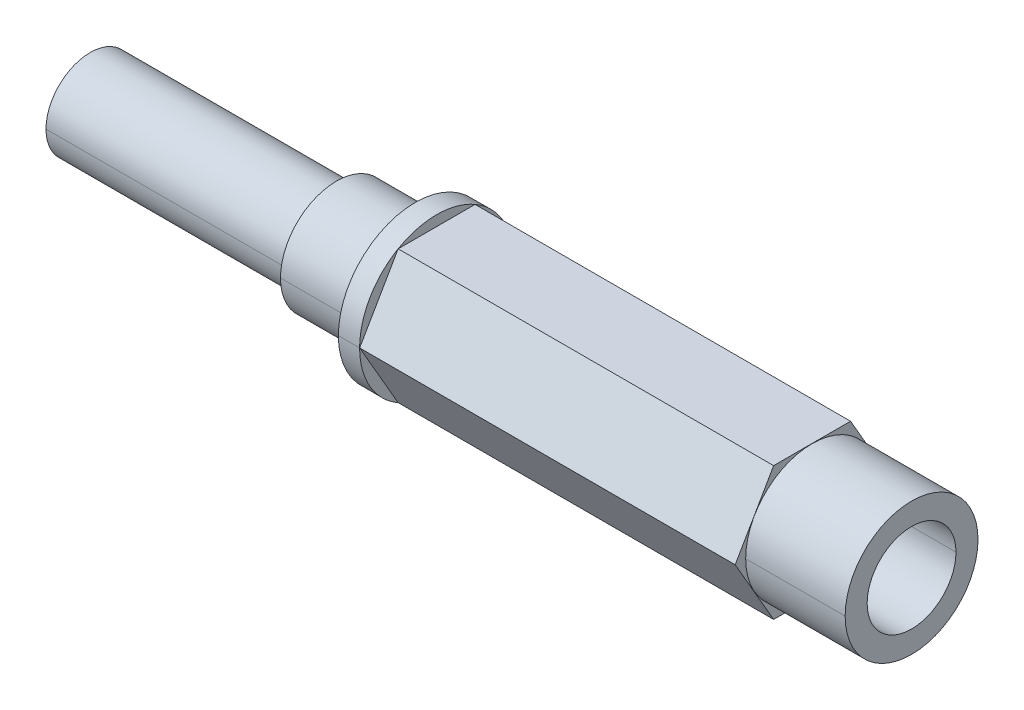
ISO-10303-21;
HEADER;
FILE_DESCRIPTION(('STEP AP214'),'2;1');
FILE_NAME('part.step','',(''),(''),'','','');
FILE_SCHEMA(('AUTOMOTIVE_DESIGN { 1 0 10303 214 1 1 1 1 }'));
ENDSEC;
DATA;
#1=APPLICATION_CONTEXT('core data for automotive mechanical design processes');
#2=APPLICATION_PROTOCOL_DEFINITION('international standard','automotive_design',2000,#1);
#3=PRODUCT_CONTEXT('',#1,'mechanical');
#4=PRODUCT('Part','Part','',(#3));
#5=PRODUCT_RELATED_PRODUCT_CATEGORY('part','',(#4));
#6=PRODUCT_DEFINITION_FORMATION('','',#4);
#7=PRODUCT_DEFINITION_CONTEXT('part definition',#1,'design');
#8=PRODUCT_DEFINITION('design','',#6,#7);
#9=PRODUCT_DEFINITION_SHAPE('','',#8);
#10=(LENGTH_UNIT() NAMED_UNIT(*) SI_UNIT(.MILLI.,.METRE.));
#11=(NAMED_UNIT(*) PLANE_ANGLE_UNIT() SI_UNIT($,.RADIAN.));
#12=(NAMED_UNIT(*) SI_UNIT($,.STERADIAN.) SOLID_ANGLE_UNIT());
#13=UNCERTAINTY_MEASURE_WITH_UNIT(LENGTH_MEASURE(1.E-05),#10,'distance_accuracy_value','');
#14=(GEOMETRIC_REPRESENTATION_CONTEXT(3) GLOBAL_UNCERTAINTY_ASSIGNED_CONTEXT((#13)) GLOBAL_UNIT_ASSIGNED_CONTEXT((#10,
#11,#12)) REPRESENTATION_CONTEXT('',''));
#15=CARTESIAN_POINT('',(0.,0.,0.));
#16=DIRECTION('',(0.,0.,1.));
#17=DIRECTION('',(1.,0.,0.));
#18=AXIS2_PLACEMENT_3D('',#15,#16,#17);
#19=CARTESIAN_POINT('',(18.0848,0.,0.));
#20=DIRECTION('',(1.,0.,0.));
#21=DIRECTION('',(0.,0.,-1.));
#22=AXIS2_PLACEMENT_3D('',#19,#20,#21);
#23=PLANE('',#22);
#24=CARTESIAN_POINT('',(18.0848,0.,0.));
#25=DIRECTION('',(1.,0.,0.));
#26=DIRECTION('',(0.,0.,-1.));
#27=AXIS2_PLACEMENT_3D('',#24,#25,#26);
#28=CIRCLE('',#27,3.17500000000007);
#29=CARTESIAN_POINT('',(18.0848,0.,-3.17500000000007));
#30=VERTEX_POINT('',#29);
#31=CARTESIAN_POINT('',(18.0848,0.,3.175));
#32=VERTEX_POINT('',#31);
#33=EDGE_CURVE('E11',#30,#32,#28,.T.);
#34=ORIENTED_EDGE('',*,*,#33,.T.);
#35=CARTESIAN_POINT('',(18.0848,0.,0.));
#36=DIRECTION('',(1.,0.,0.));
#37=DIRECTION('',(0.,0.,-1.));
#38=AXIS2_PLACEMENT_3D('',#35,#36,#37);
#39=CIRCLE('',#38,3.17500000000007);
#40=EDGE_CURVE('E249',#32,#30,#39,.T.);
#41=ORIENTED_EDGE('',*,*,#40,.T.);
#42=EDGE_LOOP('',(#34,#41));
#43=FACE_BOUND('',#42,.T.);
#44=ADVANCED_FACE('F16',(#43),#23,.T.);
#45=CARTESIAN_POINT('',(18.0848,0.,0.));
#46=DIRECTION('',(1.,0.,0.));
#47=DIRECTION('',(0.,0.,-1.));
#48=AXIS2_PLACEMENT_3D('',#45,#46,#47);
#49=CYLINDRICAL_SURFACE('',#48,3.17500000000007);
#50=DIRECTION('',(1.,0.,0.));
#51=VECTOR('',#50,1.);
#52=CARTESIAN_POINT('',(18.0848,0.,3.17500000000007));
#53=LINE('',#52,#51);
#54=CARTESIAN_POINT('',(33.9598,0.,3.175));
#55=VERTEX_POINT('',#54);
#56=EDGE_CURVE('E253',#32,#55,#53,.T.);
#57=ORIENTED_EDGE('',*,*,#56,.F.);
#58=ORIENTED_EDGE('',*,*,#33,.F.);
#59=DIRECTION('',(1.,0.,0.));
#60=VECTOR('',#59,1.);
#61=CARTESIAN_POINT('',(18.0848,0.,-3.17500000000007));
#62=LINE('',#61,#60);
#63=CARTESIAN_POINT('',(33.9598,0.,-3.17500000000007));
#64=VERTEX_POINT('',#63);
#65=EDGE_CURVE('E293',#30,#64,#62,.T.);
#66=ORIENTED_EDGE('',*,*,#65,.T.);
#67=CARTESIAN_POINT('',(33.9598,0.,0.));
#68=DIRECTION('',(1.,0.,0.));
#69=DIRECTION('',(0.,0.,-1.));
#70=AXIS2_PLACEMENT_3D('',#67,#68,#69);
#71=CIRCLE('',#70,3.17500000000007);
#72=EDGE_CURVE('E27',#64,#55,#71,.T.);
#73=ORIENTED_EDGE('',*,*,#72,.T.);
#74=EDGE_LOOP('',(#57,#58,#66,#73));
#75=FACE_BOUND('',#74,.T.);
#76=ADVANCED_FACE('F495',(#75),#49,.F.);
#77=CARTESIAN_POINT('',(33.9598,0.,0.));
#78=DIRECTION('',(1.,0.,0.));
#79=DIRECTION('',(0.,0.,-1.));
#80=AXIS2_PLACEMENT_3D('',#77,#78,#79);
#81=PLANE('',#80);
#82=ORIENTED_EDGE('',*,*,#72,.F.);
#83=CARTESIAN_POINT('',(33.9598,0.,0.));
#84=DIRECTION('',(1.,0.,0.));
#85=DIRECTION('',(0.,0.,-1.));
#86=AXIS2_PLACEMENT_3D('',#83,#84,#85);
#87=CIRCLE('',#86,3.17500000000007);
#88=EDGE_CURVE('E289',#55,#64,#87,.T.);
#89=ORIENTED_EDGE('',*,*,#88,.F.);
#90=EDGE_LOOP('',(#82,#89));
#91=FACE_BOUND('',#90,.T.);
#92=CARTESIAN_POINT('',(33.9598,0.,0.));
#93=DIRECTION('',(1.,0.,0.));
#94=DIRECTION('',(0.,0.,-1.));
#95=AXIS2_PLACEMENT_3D('',#92,#93,#94);
#96=CIRCLE('',#95,4.7498000000001);
#97=CARTESIAN_POINT('',(33.9598,0.,4.7498));
#98=VERTEX_POINT('',#97);
#99=CARTESIAN_POINT('',(33.9598,0.,-4.7498));
#100=VERTEX_POINT('',#99);
#101=EDGE_CURVE('E206',#98,#100,#96,.T.);
#102=ORIENTED_EDGE('',*,*,#101,.T.);
#103=CARTESIAN_POINT('',(33.9598,0.,0.));
#104=DIRECTION('',(1.,0.,0.));
#105=DIRECTION('',(0.,0.,-1.));
#106=AXIS2_PLACEMENT_3D('',#103,#104,#105);
#107=CIRCLE('',#106,4.7498000000001);
#108=EDGE_CURVE('E298',#100,#98,#107,.T.);
#109=ORIENTED_EDGE('',*,*,#108,.T.);
#110=EDGE_LOOP('',(#102,#109));
#111=FACE_BOUND('',#110,.T.);
#112=ADVANCED_FACE('F491',(#91,#111),#81,.T.);
#113=CARTESIAN_POINT('',(33.9598,0.,0.));
#114=DIRECTION('',(-1.,0.,0.));
#115=DIRECTION('',(0.,0.,1.));
#116=AXIS2_PLACEMENT_3D('',#113,#114,#115);
#117=CYLINDRICAL_SURFACE('',#116,4.7498000000001);
#118=DIRECTION('',(-1.,0.,0.));
#119=VECTOR('',#118,1.);
#120=CARTESIAN_POINT('',(33.9598,0.,-4.7498000000001));
#121=LINE('',#120,#119);
#122=CARTESIAN_POINT('',(26.8478,0.,-4.7498));
#123=VERTEX_POINT('',#122);
#124=EDGE_CURVE('E302',#100,#123,#121,.T.);
#125=ORIENTED_EDGE('',*,*,#124,.F.);
#126=ORIENTED_EDGE('',*,*,#101,.F.);
#127=DIRECTION('',(-1.,0.,0.));
#128=VECTOR('',#127,1.);
#129=CARTESIAN_POINT('',(33.9598,0.,4.7498000000001));
#130=LINE('',#129,#128);
#131=CARTESIAN_POINT('',(26.8478,0.,4.7498));
#132=VERTEX_POINT('',#131);
#133=EDGE_CURVE('E309',#98,#132,#130,.T.);
#134=ORIENTED_EDGE('',*,*,#133,.T.);
#135=CARTESIAN_POINT('',(26.8478,0.,0.));
#136=DIRECTION('',(1.,0.,0.));
#137=DIRECTION('',(0.,0.,-1.));
#138=AXIS2_PLACEMENT_3D('',#135,#136,#137);
#139=CIRCLE('',#138,4.7498000000001);
#140=EDGE_CURVE('E209',#132,#123,#139,.T.);
#141=ORIENTED_EDGE('',*,*,#140,.T.);
#142=EDGE_LOOP('',(#125,#126,#134,#141));
#143=FACE_BOUND('',#142,.T.);
#144=ADVANCED_FACE('F435',(#143),#117,.T.);
#145=CARTESIAN_POINT('',(-24.765,0.,0.));
#146=DIRECTION('',(-1.,0.,0.));
#147=DIRECTION('',(0.,1.,0.));
#148=AXIS2_PLACEMENT_3D('',#145,#146,#147);
#149=PLANE('',#148);
#150=CARTESIAN_POINT('',(-24.765,0.,0.));
#151=DIRECTION('',(-1.,0.,0.));
#152=DIRECTION('',(0.,0.,1.));
#153=AXIS2_PLACEMENT_3D('',#150,#151,#152);
#154=CIRCLE('',#153,3.16230000000006);
#155=CARTESIAN_POINT('',(-24.765,0.,-3.1623));
#156=VERTEX_POINT('',#155);
#157=CARTESIAN_POINT('',(-24.765,0.,3.1623));
#158=VERTEX_POINT('',#157);
#159=EDGE_CURVE('E140',#156,#158,#154,.T.);
#160=ORIENTED_EDGE('',*,*,#159,.T.);
#161=CARTESIAN_POINT('',(-24.765,0.,0.));
#162=DIRECTION('',(-1.,0.,0.));
#163=DIRECTION('',(0.,0.,1.));
#164=AXIS2_PLACEMENT_3D('',#161,#162,#163);
#165=CIRCLE('',#164,3.16230000000006);
#166=EDGE_CURVE('E247',#158,#156,#165,.T.);
#167=ORIENTED_EDGE('',*,*,#166,.T.);
#168=EDGE_LOOP('',(#160,#167));
#169=FACE_BOUND('',#168,.T.);
#170=ADVANCED_FACE('F430',(#169),#149,.T.);
#171=CARTESIAN_POINT('',(-24.765,0.,0.));
#172=DIRECTION('',(1.,0.,0.));
#173=DIRECTION('',(0.,0.,-1.));
#174=AXIS2_PLACEMENT_3D('',#171,#172,#173);
#175=CYLINDRICAL_SURFACE('',#174,3.16230000000006);
#176=DIRECTION('',(1.,0.,0.));
#177=VECTOR('',#176,1.);
#178=CARTESIAN_POINT('',(-24.765,0.,3.16230000000006));
#179=LINE('',#178,#177);
#180=CARTESIAN_POINT('',(-7.1628,0.,3.1623));
#181=VERTEX_POINT('',#180);
#182=EDGE_CURVE('E243',#158,#181,#179,.T.);
#183=ORIENTED_EDGE('',*,*,#182,.F.);
#184=ORIENTED_EDGE('',*,*,#159,.F.);
#185=DIRECTION('',(1.,0.,0.));
#186=VECTOR('',#185,1.);
#187=CARTESIAN_POINT('',(-24.765,0.,-3.16230000000006));
#188=LINE('',#187,#186);
#189=CARTESIAN_POINT('',(-7.1628,0.,-3.1623));
#190=VERTEX_POINT('',#189);
#191=EDGE_CURVE('E280',#156,#190,#188,.T.);
#192=ORIENTED_EDGE('',*,*,#191,.T.);
#193=CARTESIAN_POINT('',(-7.1628,0.,0.));
#194=DIRECTION('',(-1.,0.,0.));
#195=DIRECTION('',(0.,0.,1.));
#196=AXIS2_PLACEMENT_3D('',#193,#194,#195);
#197=CIRCLE('',#196,3.16230000000006);
#198=EDGE_CURVE('E215',#190,#181,#197,.T.);
#199=ORIENTED_EDGE('',*,*,#198,.T.);
#200=EDGE_LOOP('',(#183,#184,#192,#199));
#201=FACE_BOUND('',#200,.T.);
#202=ADVANCED_FACE('F434',(#201),#175,.T.);
#203=CARTESIAN_POINT('',(-7.1628,0.,0.));
#204=DIRECTION('',(-1.,0.,0.));
#205=DIRECTION('',(0.,1.,0.));
#206=AXIS2_PLACEMENT_3D('',#203,#204,#205);
#207=PLANE('',#206);
#208=ORIENTED_EDGE('',*,*,#198,.F.);
#209=CARTESIAN_POINT('',(-7.1628,0.,0.));
#210=DIRECTION('',(-1.,0.,0.));
#211=DIRECTION('',(0.,0.,1.));
#212=AXIS2_PLACEMENT_3D('',#209,#210,#211);
#213=CIRCLE('',#212,3.16230000000006);
#214=EDGE_CURVE('E246',#181,#190,#213,.T.);
#215=ORIENTED_EDGE('',*,*,#214,.F.);
#216=EDGE_LOOP('',(#208,#215));
#217=FACE_BOUND('',#216,.T.);
#218=CARTESIAN_POINT('',(-7.1628,0.,0.));
#219=DIRECTION('',(-1.,0.,0.));
#220=DIRECTION('',(0.,0.,1.));
#221=AXIS2_PLACEMENT_3D('',#218,#219,#220);
#222=CIRCLE('',#221,4.00000000000008);
#223=CARTESIAN_POINT('',(-7.1628,0.,-4.));
#224=VERTEX_POINT('',#223);
#225=CARTESIAN_POINT('',(-7.1628,0.,4.));
#226=VERTEX_POINT('',#225);
#227=EDGE_CURVE('E217',#224,#226,#222,.T.);
#228=ORIENTED_EDGE('',*,*,#227,.T.);
#229=CARTESIAN_POINT('',(-7.1628,0.,0.));
#230=DIRECTION('',(-1.,0.,0.));
#231=DIRECTION('',(0.,0.,1.));
#232=AXIS2_PLACEMENT_3D('',#229,#230,#231);
#233=CIRCLE('',#232,4.00000000000008);
#234=EDGE_CURVE('E236',#226,#224,#233,.T.);
#235=ORIENTED_EDGE('',*,*,#234,.T.);
#236=EDGE_LOOP('',(#228,#235));
#237=FACE_BOUND('',#236,.T.);
#238=ADVANCED_FACE('F354',(#217,#237),#207,.T.);
#239=CARTESIAN_POINT('',(-7.1628,0.,0.));
#240=DIRECTION('',(1.,0.,0.));
#241=DIRECTION('',(0.,0.,-1.));
#242=AXIS2_PLACEMENT_3D('',#239,#240,#241);
#243=CYLINDRICAL_SURFACE('',#242,4.00000000000008);
#244=DIRECTION('',(1.,0.,0.));
#245=VECTOR('',#244,1.);
#246=CARTESIAN_POINT('',(-7.1628,0.,4.00000000000008));
#247=LINE('',#246,#245);
#248=CARTESIAN_POINT('',(-1.524,0.,4.));
#249=VERTEX_POINT('',#248);
#250=EDGE_CURVE('E231',#226,#249,#247,.T.);
#251=ORIENTED_EDGE('',*,*,#250,.F.);
#252=ORIENTED_EDGE('',*,*,#227,.F.);
#253=DIRECTION('',(1.,0.,0.));
#254=VECTOR('',#253,1.);
#255=CARTESIAN_POINT('',(-7.1628,0.,-4.00000000000008));
#256=LINE('',#255,#254);
#257=CARTESIAN_POINT('',(-1.524,0.,-4.));
#258=VERTEX_POINT('',#257);
#259=EDGE_CURVE('E237',#224,#258,#256,.T.);
#260=ORIENTED_EDGE('',*,*,#259,.T.);
#261=CARTESIAN_POINT('',(-1.524,0.,0.));
#262=DIRECTION('',(-1.,0.,0.));
#263=DIRECTION('',(0.,0.,1.));
#264=AXIS2_PLACEMENT_3D('',#261,#262,#263);
#265=CIRCLE('',#264,4.00000000000008);
#266=EDGE_CURVE('E20',#258,#249,#265,.T.);
#267=ORIENTED_EDGE('',*,*,#266,.T.);
#268=EDGE_LOOP('',(#251,#252,#260,#267));
#269=FACE_BOUND('',#268,.T.);
#270=ADVANCED_FACE('F344',(#269),#243,.T.);
#271=CARTESIAN_POINT('',(0.,0.,0.));
#272=DIRECTION('',(-1.,0.,0.));
#273=DIRECTION('',(0.,1.,0.));
#274=AXIS2_PLACEMENT_3D('',#271,#272,#273);
#275=PLANE('',#274);
#276=DIRECTION('',(0.,0.866025403784439,-0.5));
#277=VECTOR('',#276,1.);
#278=CARTESIAN_POINT('',(0.,-4.7625,-2.74963065701596));
#279=LINE('',#278,#277);
#280=CARTESIAN_POINT('',(0.,-4.7625,-2.74963065701596));
#281=VERTEX_POINT('',#280);
#282=CARTESIAN_POINT('',(0.,1.38777878078145E-13,-5.49926131403132));
#283=VERTEX_POINT('',#282);
#284=EDGE_CURVE('E219',#281,#283,#279,.T.);
#285=ORIENTED_EDGE('',*,*,#284,.F.);
#286=DIRECTION('',(0.,0.,-1.));
#287=VECTOR('',#286,1.);
#288=CARTESIAN_POINT('',(0.,-4.7625,2.74963065701558));
#289=LINE('',#288,#287);
#290=CARTESIAN_POINT('',(0.,-4.7625,2.74963065701558));
#291=VERTEX_POINT('',#290);
#292=EDGE_CURVE('E173',#291,#281,#289,.T.);
#293=ORIENTED_EDGE('',*,*,#292,.F.);
#294=DIRECTION('',(0.,-0.866025403784438,-0.5));
#295=VECTOR('',#294,1.);
#296=CARTESIAN_POINT('',(0.,2.22044604925032E-13,5.49926131403108));
#297=LINE('',#296,#295);
#298=CARTESIAN_POINT('',(0.,2.22044604925032E-13,5.49926131403108));
#299=VERTEX_POINT('',#298);
#300=EDGE_CURVE('E186',#299,#291,#297,.T.);
#301=ORIENTED_EDGE('',*,*,#300,.F.);
#302=DIRECTION('',(0.,-0.866025403784439,0.5));
#303=VECTOR('',#302,1.);
#304=CARTESIAN_POINT('',(0.,4.7625,2.74963065701542));
#305=LINE('',#304,#303);
#306=CARTESIAN_POINT('',(0.,4.7625,2.74963065701542));
#307=VERTEX_POINT('',#306);
#308=EDGE_CURVE('E190',#307,#299,#305,.T.);
#309=ORIENTED_EDGE('',*,*,#308,.F.);
#310=DIRECTION('',(0.,0.,1.));
#311=VECTOR('',#310,1.);
#312=CARTESIAN_POINT('',(0.,4.7625,-2.7496306570156));
#313=LINE('',#312,#311);
#314=CARTESIAN_POINT('',(0.,4.7625,-2.7496306570156));
#315=VERTEX_POINT('',#314);
#316=EDGE_CURVE('E204',#315,#307,#313,.T.);
#317=ORIENTED_EDGE('',*,*,#316,.F.);
#318=DIRECTION('',(0.,0.866025403784438,0.5));
#319=VECTOR('',#318,1.);
#320=CARTESIAN_POINT('',(0.,1.38777878078145E-13,-5.49926131403132));
#321=LINE('',#320,#319);
#322=EDGE_CURVE('E254',#283,#315,#321,.T.);
#323=ORIENTED_EDGE('',*,*,#322,.F.);
#324=EDGE_LOOP('',(#285,#293,#301,#309,#317,#323));
#325=FACE_BOUND('',#324,.T.);
#326=CARTESIAN_POINT('',(0.,0.,0.));
#327=DIRECTION('',(-1.,0.,0.));
#328=DIRECTION('',(0.,0.,1.));
#329=AXIS2_PLACEMENT_3D('',#326,#327,#328);
#330=CIRCLE('',#329,5.50000000000011);
#331=CARTESIAN_POINT('',(0.,0.,-5.5));
#332=VERTEX_POINT('',#331);
#333=CARTESIAN_POINT('',(0.,0.,5.5));
#334=VERTEX_POINT('',#333);
#335=EDGE_CURVE('E261',#332,#334,#330,.T.);
#336=ORIENTED_EDGE('',*,*,#335,.F.);
#337=CARTESIAN_POINT('',(0.,0.,0.));
#338=DIRECTION('',(-1.,0.,0.));
#339=DIRECTION('',(0.,0.,1.));
#340=AXIS2_PLACEMENT_3D('',#337,#338,#339);
#341=CIRCLE('',#340,5.50000000000011);
#342=EDGE_CURVE('E274',#334,#332,#341,.T.);
#343=ORIENTED_EDGE('',*,*,#342,.F.);
#344=EDGE_LOOP('',(#336,#343));
#345=FACE_BOUND('',#344,.T.);
#346=ADVANCED_FACE('F486',(#325,#345),#275,.F.);
#347=CARTESIAN_POINT('',(-1.524,0.,0.));
#348=DIRECTION('',(-1.,0.,0.));
#349=DIRECTION('',(0.,1.,0.));
#350=AXIS2_PLACEMENT_3D('',#347,#348,#349);
#351=PLANE('',#350);
#352=ORIENTED_EDGE('',*,*,#266,.F.);
#353=CARTESIAN_POINT('',(-1.524,0.,0.));
#354=DIRECTION('',(-1.,0.,0.));
#355=DIRECTION('',(0.,0.,1.));
#356=AXIS2_PLACEMENT_3D('',#353,#354,#355);
#357=CIRCLE('',#356,4.00000000000008);
#358=EDGE_CURVE('E235',#249,#258,#357,.T.);
#359=ORIENTED_EDGE('',*,*,#358,.F.);
#360=EDGE_LOOP('',(#352,#359));
#361=FACE_BOUND('',#360,.T.);
#362=CARTESIAN_POINT('',(-1.524,0.,0.));
#363=DIRECTION('',(-1.,0.,0.));
#364=DIRECTION('',(0.,0.,1.));
#365=AXIS2_PLACEMENT_3D('',#362,#363,#364);
#366=CIRCLE('',#365,5.50000000000011);
#367=CARTESIAN_POINT('',(-1.524,0.,-5.5));
#368=VERTEX_POINT('',#367);
#369=CARTESIAN_POINT('',(-1.524,0.,5.5));
#370=VERTEX_POINT('',#369);
#371=EDGE_CURVE('E85',#368,#370,#366,.T.);
#372=ORIENTED_EDGE('',*,*,#371,.T.);
#373=CARTESIAN_POINT('',(-1.524,0.,0.));
#374=DIRECTION('',(-1.,0.,0.));
#375=DIRECTION('',(0.,0.,1.));
#376=AXIS2_PLACEMENT_3D('',#373,#374,#375);
#377=CIRCLE('',#376,5.50000000000011);
#378=EDGE_CURVE('E240',#370,#368,#377,.T.);
#379=ORIENTED_EDGE('',*,*,#378,.T.);
#380=EDGE_LOOP('',(#372,#379));
#381=FACE_BOUND('',#380,.T.);
#382=ADVANCED_FACE('F348',(#361,#381),#351,.T.);
#383=CARTESIAN_POINT('',(-1.524,0.,0.));
#384=DIRECTION('',(1.,0.,0.));
#385=DIRECTION('',(0.,0.,-1.));
#386=AXIS2_PLACEMENT_3D('',#383,#384,#385);
#387=CYLINDRICAL_SURFACE('',#386,5.50000000000011);
#388=DIRECTION('',(1.,0.,0.));
#389=VECTOR('',#388,1.);
#390=CARTESIAN_POINT('',(-1.524,0.,5.50000000000011));
#391=LINE('',#390,#389);
#392=EDGE_CURVE('E270',#370,#334,#391,.T.);
#393=ORIENTED_EDGE('',*,*,#392,.F.);
#394=ORIENTED_EDGE('',*,*,#371,.F.);
#395=DIRECTION('',(1.,0.,0.));
#396=VECTOR('',#395,1.);
#397=CARTESIAN_POINT('',(-1.524,0.,-5.50000000000011));
#398=LINE('',#397,#396);
#399=EDGE_CURVE('E224',#368,#332,#398,.T.);
#400=ORIENTED_EDGE('',*,*,#399,.T.);
#401=ORIENTED_EDGE('',*,*,#335,.T.);
#402=EDGE_LOOP('',(#393,#394,#400,#401));
#403=FACE_BOUND('',#402,.T.);
#404=ADVANCED_FACE('F485',(#403),#387,.T.);
#405=CARTESIAN_POINT('',(26.8478,0.,0.));
#406=DIRECTION('',(1.,0.,0.));
#407=DIRECTION('',(0.,0.,-1.));
#408=AXIS2_PLACEMENT_3D('',#405,#406,#407);
#409=PLANE('',#408);
#410=ORIENTED_EDGE('',*,*,#140,.F.);
#411=CARTESIAN_POINT('',(26.8478,0.,0.));
#412=DIRECTION('',(1.,0.,0.));
#413=DIRECTION('',(0.,0.,-1.));
#414=AXIS2_PLACEMENT_3D('',#411,#412,#413);
#415=CIRCLE('',#414,4.7498000000001);
#416=EDGE_CURVE('E313',#123,#132,#415,.T.);
#417=ORIENTED_EDGE('',*,*,#416,.F.);
#418=EDGE_LOOP('',(#410,#417));
#419=FACE_BOUND('',#418,.T.);
#420=DIRECTION('',(0.,0.866025403784439,-0.5));
#421=VECTOR('',#420,1.);
#422=CARTESIAN_POINT('',(26.8478,-4.7625,-2.74963065701564));
#423=LINE('',#422,#421);
#424=CARTESIAN_POINT('',(26.8478,-4.7625,-2.74963065701564));
#425=VERTEX_POINT('',#424);
#426=CARTESIAN_POINT('',(26.8478,1.31838984174237E-13,-5.49926131403134));
#427=VERTEX_POINT('',#426);
#428=EDGE_CURVE('E230',#425,#427,#423,.T.);
#429=ORIENTED_EDGE('',*,*,#428,.T.);
#430=DIRECTION('',(0.,0.866025403784438,0.5));
#431=VECTOR('',#430,1.);
#432=CARTESIAN_POINT('',(26.8478,1.31838984174237E-13,-5.49926131403134));
#433=LINE('',#432,#431);
#434=CARTESIAN_POINT('',(26.8478,4.7625,-2.7496306570156));
#435=VERTEX_POINT('',#434);
#436=EDGE_CURVE('E201',#427,#435,#433,.T.);
#437=ORIENTED_EDGE('',*,*,#436,.T.);
#438=DIRECTION('',(0.,0.,1.));
#439=VECTOR('',#438,1.);
#440=CARTESIAN_POINT('',(26.8478,4.7625,-2.7496306570156));
#441=LINE('',#440,#439);
#442=CARTESIAN_POINT('',(26.8478,4.76250000000009,2.74963065701544));
#443=VERTEX_POINT('',#442);
#444=EDGE_CURVE('E181',#435,#443,#441,.T.);
#445=ORIENTED_EDGE('',*,*,#444,.T.);
#446=DIRECTION('',(0.,-0.866025403784439,0.5));
#447=VECTOR('',#446,1.);
#448=CARTESIAN_POINT('',(26.8478,4.76250000000009,2.74963065701544));
#449=LINE('',#448,#447);
#450=CARTESIAN_POINT('',(26.8478,2.4980018054066E-13,5.49926131403108));
#451=VERTEX_POINT('',#450);
#452=EDGE_CURVE('E177',#443,#451,#449,.T.);
#453=ORIENTED_EDGE('',*,*,#452,.T.);
#454=DIRECTION('',(0.,-0.866025403784438,-0.5));
#455=VECTOR('',#454,1.);
#456=CARTESIAN_POINT('',(26.8478,2.4980018054066E-13,5.49926131403108));
#457=LINE('',#456,#455);
#458=CARTESIAN_POINT('',(26.8478,-4.7625,2.74963065701557));
#459=VERTEX_POINT('',#458);
#460=EDGE_CURVE('E163',#451,#459,#457,.T.);
#461=ORIENTED_EDGE('',*,*,#460,.T.);
#462=DIRECTION('',(0.,0.,-1.));
#463=VECTOR('',#462,1.);
#464=CARTESIAN_POINT('',(26.8478,-4.7625,2.74963065701557));
#465=LINE('',#464,#463);
#466=EDGE_CURVE('E42',#459,#425,#465,.T.);
#467=ORIENTED_EDGE('',*,*,#466,.T.);
#468=EDGE_LOOP('',(#429,#437,#445,#453,#461,#467));
#469=FACE_BOUND('',#468,.T.);
#470=ADVANCED_FACE('F179',(#419,#469),#409,.T.);
#471=CARTESIAN_POINT('',(26.8478,-4.7625,2.74963065701557));
#472=DIRECTION('',(0.,1.,0.));
#473=DIRECTION('',(0.,0.,-1.));
#474=AXIS2_PLACEMENT_3D('',#471,#472,#473);
#475=PLANE('',#474);
#476=ORIENTED_EDGE('',*,*,#292,.T.);
#477=DIRECTION('',(-1.,0.,0.));
#478=VECTOR('',#477,1.);
#479=CARTESIAN_POINT('',(26.8478,-4.7625,-2.74963065701564));
#480=LINE('',#479,#478);
#481=EDGE_CURVE('E258',#425,#281,#480,.T.);
#482=ORIENTED_EDGE('',*,*,#481,.F.);
#483=ORIENTED_EDGE('',*,*,#466,.F.);
#484=DIRECTION('',(-1.,0.,0.));
#485=VECTOR('',#484,1.);
#486=CARTESIAN_POINT('',(26.8478,-4.7625,2.74963065701557));
#487=LINE('',#486,#485);
#488=EDGE_CURVE('E170',#459,#291,#487,.T.);
#489=ORIENTED_EDGE('',*,*,#488,.T.);
#490=EDGE_LOOP('',(#476,#482,#483,#489));
#491=FACE_BOUND('',#490,.T.);
#492=ADVANCED_FACE('F519',(#491),#475,.F.);
#493=CARTESIAN_POINT('',(26.8478,2.4980018054066E-13,5.49926131403108));
#494=DIRECTION('',(0.,0.5,-0.866025403784438));
#495=DIRECTION('',(-1.,0.,0.));
#496=AXIS2_PLACEMENT_3D('',#493,#494,#495);
#497=PLANE('',#496);
#498=ORIENTED_EDGE('',*,*,#300,.T.);
#499=ORIENTED_EDGE('',*,*,#488,.F.);
#500=ORIENTED_EDGE('',*,*,#460,.F.);
#501=DIRECTION('',(-1.,0.,0.));
#502=VECTOR('',#501,1.);
#503=CARTESIAN_POINT('',(26.8478,2.4980018054066E-13,5.49926131403108));
#504=LINE('',#503,#502);
#505=EDGE_CURVE('E168',#451,#299,#504,.T.);
#506=ORIENTED_EDGE('',*,*,#505,.T.);
#507=EDGE_LOOP('',(#498,#499,#500,#506));
#508=FACE_BOUND('',#507,.T.);
#509=ADVANCED_FACE('F166',(#508),#497,.F.);
#510=CARTESIAN_POINT('',(26.8478,4.76250000000009,2.74963065701544));
#511=DIRECTION('',(0.,-0.5,-0.866025403784439));
#512=DIRECTION('',(0.,-0.866025403784439,0.5));
#513=AXIS2_PLACEMENT_3D('',#510,#511,#512);
#514=PLANE('',#513);
#515=ORIENTED_EDGE('',*,*,#308,.T.);
#516=ORIENTED_EDGE('',*,*,#505,.F.);
#517=ORIENTED_EDGE('',*,*,#452,.F.);
#518=DIRECTION('',(-1.,0.,0.));
#519=VECTOR('',#518,1.);
#520=CARTESIAN_POINT('',(26.8478,4.76250000000009,2.74963065701544));
#521=LINE('',#520,#519);
#522=EDGE_CURVE('E297',#443,#307,#521,.T.);
#523=ORIENTED_EDGE('',*,*,#522,.T.);
#524=EDGE_LOOP('',(#515,#516,#517,#523));
#525=FACE_BOUND('',#524,.T.);
#526=ADVANCED_FACE('F188',(#525),#514,.F.);
#527=CARTESIAN_POINT('',(26.8478,4.7625,-2.7496306570156));
#528=DIRECTION('',(0.,-1.,0.));
#529=DIRECTION('',(0.,0.,-1.));
#530=AXIS2_PLACEMENT_3D('',#527,#528,#529);
#531=PLANE('',#530);
#532=ORIENTED_EDGE('',*,*,#316,.T.);
#533=ORIENTED_EDGE('',*,*,#522,.F.);
#534=ORIENTED_EDGE('',*,*,#444,.F.);
#535=DIRECTION('',(-1.,0.,0.));
#536=VECTOR('',#535,1.);
#537=CARTESIAN_POINT('',(26.8478,4.7625,-2.7496306570156));
#538=LINE('',#537,#536);
#539=EDGE_CURVE('E205',#435,#315,#538,.T.);
#540=ORIENTED_EDGE('',*,*,#539,.T.);
#541=EDGE_LOOP('',(#532,#533,#534,#540));
#542=FACE_BOUND('',#541,.T.);
#543=ADVANCED_FACE('F18',(#542),#531,.F.);
#544=CARTESIAN_POINT('',(26.8478,1.31838984174237E-13,-5.49926131403134));
#545=DIRECTION('',(0.,-0.5,0.866025403784438));
#546=DIRECTION('',(-1.,0.,0.));
#547=AXIS2_PLACEMENT_3D('',#544,#545,#546);
#548=PLANE('',#547);
#549=ORIENTED_EDGE('',*,*,#322,.T.);
#550=ORIENTED_EDGE('',*,*,#539,.F.);
#551=ORIENTED_EDGE('',*,*,#436,.F.);
#552=DIRECTION('',(-1.,0.,0.));
#553=VECTOR('',#552,1.);
#554=CARTESIAN_POINT('',(26.8478,1.31838984174237E-13,-5.49926131403134));
#555=LINE('',#554,#553);
#556=EDGE_CURVE('E223',#427,#283,#555,.T.);
#557=ORIENTED_EDGE('',*,*,#556,.T.);
#558=EDGE_LOOP('',(#549,#550,#551,#557));
#559=FACE_BOUND('',#558,.T.);
#560=ADVANCED_FACE('F416',(#559),#548,.F.);
#561=CARTESIAN_POINT('',(26.8478,-4.7625,-2.74963065701564));
#562=DIRECTION('',(0.,0.5,0.866025403784439));
#563=DIRECTION('',(1.,0.,0.));
#564=AXIS2_PLACEMENT_3D('',#561,#562,#563);
#565=PLANE('',#564);
#566=ORIENTED_EDGE('',*,*,#284,.T.);
#567=ORIENTED_EDGE('',*,*,#556,.F.);
#568=ORIENTED_EDGE('',*,*,#428,.F.);
#569=ORIENTED_EDGE('',*,*,#481,.T.);
#570=EDGE_LOOP('',(#566,#567,#568,#569));
#571=FACE_BOUND('',#570,.T.);
#572=ADVANCED_FACE('F440',(#571),#565,.F.);
#573=CARTESIAN_POINT('',(-1.524,0.,0.));
#574=DIRECTION('',(1.,0.,0.));
#575=DIRECTION('',(0.,0.,-1.));
#576=AXIS2_PLACEMENT_3D('',#573,#574,#575);
#577=CYLINDRICAL_SURFACE('',#576,5.50000000000011);
#578=ORIENTED_EDGE('',*,*,#378,.F.);
#579=ORIENTED_EDGE('',*,*,#392,.T.);
#580=ORIENTED_EDGE('',*,*,#342,.T.);
#581=ORIENTED_EDGE('',*,*,#399,.F.);
#582=EDGE_LOOP('',(#578,#579,#580,#581));
#583=FACE_BOUND('',#582,.T.);
#584=ADVANCED_FACE('F444',(#583),#577,.T.);
#585=CARTESIAN_POINT('',(-7.1628,0.,0.));
#586=DIRECTION('',(1.,0.,0.));
#587=DIRECTION('',(0.,0.,-1.));
#588=AXIS2_PLACEMENT_3D('',#585,#586,#587);
#589=CYLINDRICAL_SURFACE('',#588,4.00000000000008);
#590=ORIENTED_EDGE('',*,*,#234,.F.);
#591=ORIENTED_EDGE('',*,*,#250,.T.);
#592=ORIENTED_EDGE('',*,*,#358,.T.);
#593=ORIENTED_EDGE('',*,*,#259,.F.);
#594=EDGE_LOOP('',(#590,#591,#592,#593));
#595=FACE_BOUND('',#594,.T.);
#596=ADVANCED_FACE('F350',(#595),#589,.T.);
#597=CARTESIAN_POINT('',(-24.765,0.,0.));
#598=DIRECTION('',(1.,0.,0.));
#599=DIRECTION('',(0.,0.,-1.));
#600=AXIS2_PLACEMENT_3D('',#597,#598,#599);
#601=CYLINDRICAL_SURFACE('',#600,3.16230000000006);
#602=ORIENTED_EDGE('',*,*,#166,.F.);
#603=ORIENTED_EDGE('',*,*,#182,.T.);
#604=ORIENTED_EDGE('',*,*,#214,.T.);
#605=ORIENTED_EDGE('',*,*,#191,.F.);
#606=EDGE_LOOP('',(#602,#603,#604,#605));
#607=FACE_BOUND('',#606,.T.);
#608=ADVANCED_FACE('F461',(#607),#601,.T.);
#609=CARTESIAN_POINT('',(33.9598,0.,0.));
#610=DIRECTION('',(-1.,0.,0.));
#611=DIRECTION('',(0.,0.,1.));
#612=AXIS2_PLACEMENT_3D('',#609,#610,#611);
#613=CYLINDRICAL_SURFACE('',#612,4.7498000000001);
#614=ORIENTED_EDGE('',*,*,#108,.F.);
#615=ORIENTED_EDGE('',*,*,#124,.T.);
#616=ORIENTED_EDGE('',*,*,#416,.T.);
#617=ORIENTED_EDGE('',*,*,#133,.F.);
#618=EDGE_LOOP('',(#614,#615,#616,#617));
#619=FACE_BOUND('',#618,.T.);
#620=ADVANCED_FACE('F425',(#619),#613,.T.);
#621=CARTESIAN_POINT('',(18.0848,0.,0.));
#622=DIRECTION('',(1.,0.,0.));
#623=DIRECTION('',(0.,0.,-1.));
#624=AXIS2_PLACEMENT_3D('',#621,#622,#623);
#625=CYLINDRICAL_SURFACE('',#624,3.17500000000007);
#626=ORIENTED_EDGE('',*,*,#40,.F.);
#627=ORIENTED_EDGE('',*,*,#56,.T.);
#628=ORIENTED_EDGE('',*,*,#88,.T.);
#629=ORIENTED_EDGE('',*,*,#65,.F.);
#630=EDGE_LOOP('',(#626,#627,#628,#629));
#631=FACE_BOUND('',#630,.T.);
#632=ADVANCED_FACE('F421',(#631),#625,.F.);
#633=CLOSED_SHELL('',(#44,#76,#112,#144,#170,#202,#238,#270,#346,#382,#404,#470,#492,#509,#526,
#543,#560,#572,#584,#596,#608,#620,#632));
#634=MANIFOLD_SOLID_BREP('B1',#633);
#635=ADVANCED_BREP_SHAPE_REPRESENTATION('',(#18,#634),#14);
#636=SHAPE_DEFINITION_REPRESENTATION(#9,#635);
ENDSEC;
END-ISO-10303-21;
